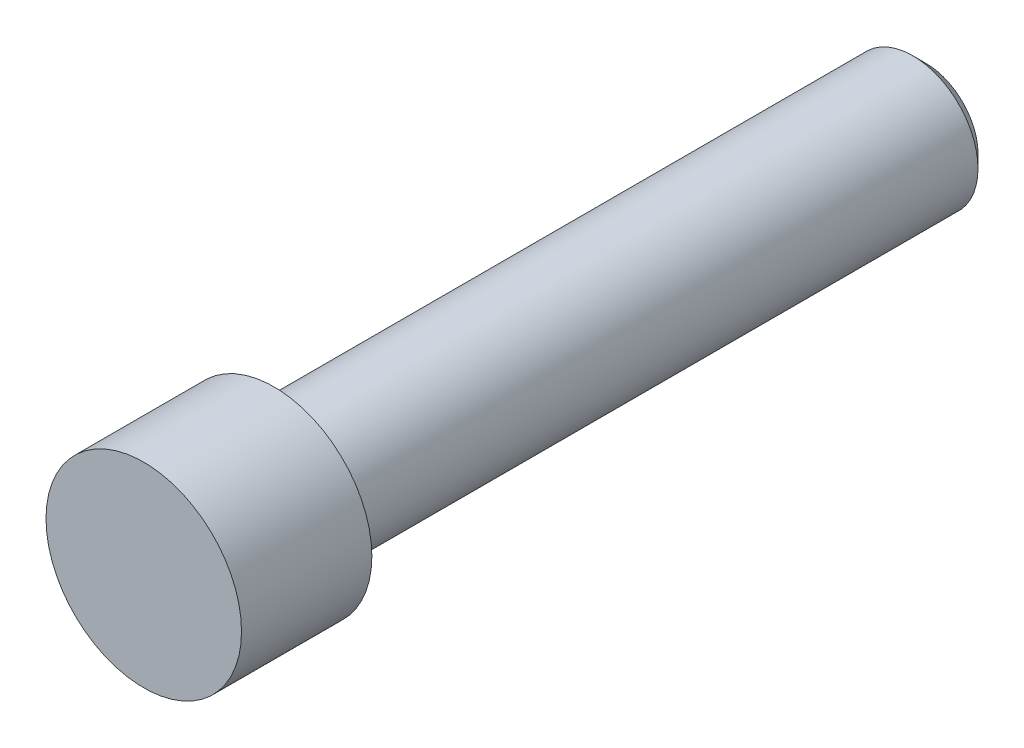
ISO-10303-21;
HEADER;
FILE_DESCRIPTION(('STEP AP214'),'2;1');
FILE_NAME('part.step','',(''),(''),'','','');
FILE_SCHEMA(('AUTOMOTIVE_DESIGN { 1 0 10303 214 1 1 1 1 }'));
ENDSEC;
DATA;
#1=APPLICATION_CONTEXT('core data for automotive mechanical design processes');
#2=APPLICATION_PROTOCOL_DEFINITION('international standard','automotive_design',2000,#1);
#3=PRODUCT_CONTEXT('',#1,'mechanical');
#4=PRODUCT('Part','Part','',(#3));
#5=PRODUCT_RELATED_PRODUCT_CATEGORY('part','',(#4));
#6=PRODUCT_DEFINITION_FORMATION('','',#4);
#7=PRODUCT_DEFINITION_CONTEXT('part definition',#1,'design');
#8=PRODUCT_DEFINITION('design','',#6,#7);
#9=PRODUCT_DEFINITION_SHAPE('','',#8);
#10=(LENGTH_UNIT() NAMED_UNIT(*) SI_UNIT(.MILLI.,.METRE.));
#11=(NAMED_UNIT(*) PLANE_ANGLE_UNIT() SI_UNIT($,.RADIAN.));
#12=(NAMED_UNIT(*) SI_UNIT($,.STERADIAN.) SOLID_ANGLE_UNIT());
#13=UNCERTAINTY_MEASURE_WITH_UNIT(LENGTH_MEASURE(1.E-05),#10,'distance_accuracy_value','');
#14=(GEOMETRIC_REPRESENTATION_CONTEXT(3) GLOBAL_UNCERTAINTY_ASSIGNED_CONTEXT((#13)) GLOBAL_UNIT_ASSIGNED_CONTEXT((#10,
#11,#12)) REPRESENTATION_CONTEXT('',''));
#15=CARTESIAN_POINT('',(0.,0.,0.));
#16=DIRECTION('',(0.,0.,1.));
#17=DIRECTION('',(1.,0.,0.));
#18=AXIS2_PLACEMENT_3D('',#15,#16,#17);
#19=CARTESIAN_POINT('',(0.,0.,10.));
#20=DIRECTION('',(0.,0.,-1.));
#21=DIRECTION('',(-1.,0.,0.));
#22=AXIS2_PLACEMENT_3D('',#19,#20,#21);
#23=CYLINDRICAL_SURFACE('',#22,1.);
#24=CARTESIAN_POINT('',(0.,0.,0.200000000000001));
#25=DIRECTION('',(0.,0.,1.));
#26=DIRECTION('',(1.,0.,0.));
#27=AXIS2_PLACEMENT_3D('',#24,#25,#26);
#28=CIRCLE('',#27,1.);
#29=CARTESIAN_POINT('',(1.,0.,0.200000000000001));
#30=VERTEX_POINT('',#29);
#31=EDGE_CURVE('E54',#30,#30,#28,.T.);
#32=ORIENTED_EDGE('',*,*,#31,.T.);
#33=EDGE_LOOP('',(#32));
#34=FACE_BOUND('',#33,.T.);
#35=CARTESIAN_POINT('',(0.,0.,10.));
#36=DIRECTION('',(0.,0.,1.));
#37=DIRECTION('',(1.,0.,0.));
#38=AXIS2_PLACEMENT_3D('',#35,#36,#37);
#39=CIRCLE('',#38,1.);
#40=CARTESIAN_POINT('',(1.,0.,10.));
#41=VERTEX_POINT('',#40);
#42=EDGE_CURVE('E59',#41,#41,#39,.T.);
#43=ORIENTED_EDGE('',*,*,#42,.F.);
#44=EDGE_LOOP('',(#43));
#45=FACE_BOUND('',#44,.T.);
#46=ADVANCED_FACE('F45',(#34,#45),#23,.T.);
#47=CARTESIAN_POINT('',(0.,0.,0.));
#48=DIRECTION('',(0.,0.,1.));
#49=DIRECTION('',(1.,0.,0.));
#50=AXIS2_PLACEMENT_3D('',#47,#48,#49);
#51=PLANE('',#50);
#52=CARTESIAN_POINT('',(0.,0.,0.));
#53=DIRECTION('',(0.,0.,1.));
#54=DIRECTION('',(1.,0.,0.));
#55=AXIS2_PLACEMENT_3D('',#52,#53,#54);
#56=CIRCLE('',#55,0.799999999999998);
#57=CARTESIAN_POINT('',(0.799999999999998,0.,0.));
#58=VERTEX_POINT('',#57);
#59=EDGE_CURVE('E10',#58,#58,#56,.F.);
#60=ORIENTED_EDGE('',*,*,#59,.T.);
#61=EDGE_LOOP('',(#60));
#62=FACE_BOUND('',#61,.T.);
#63=ADVANCED_FACE('F92',(#62),#51,.F.);
#64=CARTESIAN_POINT('',(0.,0.,0.200000000000001));
#65=DIRECTION('',(0.,0.,1.));
#66=DIRECTION('',(1.,0.,0.));
#67=AXIS2_PLACEMENT_3D('',#64,#65,#66);
#68=CONICAL_SURFACE('',#67,1.,0.785398163397453);
#69=ORIENTED_EDGE('',*,*,#59,.F.);
#70=EDGE_LOOP('',(#69));
#71=FACE_BOUND('',#70,.T.);
#72=ORIENTED_EDGE('',*,*,#31,.F.);
#73=EDGE_LOOP('',(#72));
#74=FACE_BOUND('',#73,.T.);
#75=ADVANCED_FACE('F48',(#71,#74),#68,.T.);
#76=CARTESIAN_POINT('',(0.,0.,12.));
#77=DIRECTION('',(0.,0.,-1.));
#78=DIRECTION('',(-1.,0.,0.));
#79=AXIS2_PLACEMENT_3D('',#76,#77,#78);
#80=CYLINDRICAL_SURFACE('',#79,1.5);
#81=CARTESIAN_POINT('',(0.,0.,12.));
#82=DIRECTION('',(0.,0.,1.));
#83=DIRECTION('',(1.,0.,0.));
#84=AXIS2_PLACEMENT_3D('',#81,#82,#83);
#85=CIRCLE('',#84,1.5);
#86=CARTESIAN_POINT('',(1.5,0.,12.));
#87=VERTEX_POINT('',#86);
#88=EDGE_CURVE('E64',#87,#87,#85,.T.);
#89=ORIENTED_EDGE('',*,*,#88,.F.);
#90=EDGE_LOOP('',(#89));
#91=FACE_BOUND('',#90,.T.);
#92=CARTESIAN_POINT('',(0.,0.,10.));
#93=DIRECTION('',(0.,0.,1.));
#94=DIRECTION('',(1.,0.,0.));
#95=AXIS2_PLACEMENT_3D('',#92,#93,#94);
#96=CIRCLE('',#95,1.5);
#97=CARTESIAN_POINT('',(1.5,0.,10.));
#98=VERTEX_POINT('',#97);
#99=EDGE_CURVE('E67',#98,#98,#96,.T.);
#100=ORIENTED_EDGE('',*,*,#99,.T.);
#101=EDGE_LOOP('',(#100));
#102=FACE_BOUND('',#101,.T.);
#103=ADVANCED_FACE('F77',(#91,#102),#80,.T.);
#104=CARTESIAN_POINT('',(0.,0.,12.));
#105=DIRECTION('',(0.,0.,1.));
#106=DIRECTION('',(1.,0.,0.));
#107=AXIS2_PLACEMENT_3D('',#104,#105,#106);
#108=PLANE('',#107);
#109=ORIENTED_EDGE('',*,*,#88,.T.);
#110=EDGE_LOOP('',(#109));
#111=FACE_BOUND('',#110,.T.);
#112=ADVANCED_FACE('F75',(#111),#108,.T.);
#113=CARTESIAN_POINT('',(0.,0.,10.));
#114=DIRECTION('',(0.,0.,1.));
#115=DIRECTION('',(1.,0.,0.));
#116=AXIS2_PLACEMENT_3D('',#113,#114,#115);
#117=PLANE('',#116);
#118=ORIENTED_EDGE('',*,*,#42,.T.);
#119=EDGE_LOOP('',(#118));
#120=FACE_BOUND('',#119,.T.);
#121=ORIENTED_EDGE('',*,*,#99,.F.);
#122=EDGE_LOOP('',(#121));
#123=FACE_BOUND('',#122,.T.);
#124=ADVANCED_FACE('F83',(#120,#123),#117,.F.);
#125=CLOSED_SHELL('',(#46,#63,#75,#103,#112,#124));
#126=MANIFOLD_SOLID_BREP('B2',#125);
#127=ADVANCED_BREP_SHAPE_REPRESENTATION('',(#18,#126),#14);
#128=SHAPE_DEFINITION_REPRESENTATION(#9,#127);
ENDSEC;
END-ISO-10303-21;
